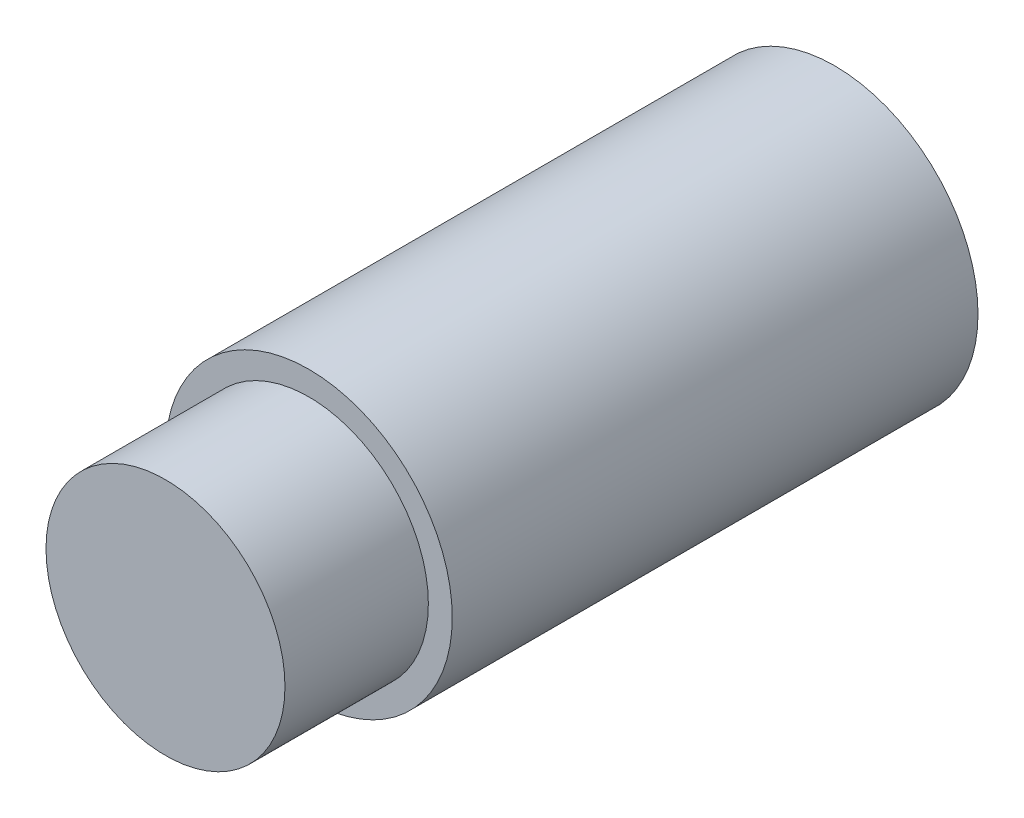
ISO-10303-21;
HEADER;
FILE_DESCRIPTION(('STEP AP214'),'2;1');
FILE_NAME('part.step','',(''),(''),'','','');
FILE_SCHEMA(('AUTOMOTIVE_DESIGN { 1 0 10303 214 1 1 1 1 }'));
ENDSEC;
DATA;
#1=APPLICATION_CONTEXT('core data for automotive mechanical design processes');
#2=APPLICATION_PROTOCOL_DEFINITION('international standard','automotive_design',2000,#1);
#3=PRODUCT_CONTEXT('',#1,'mechanical');
#4=PRODUCT('Part','Part','',(#3));
#5=PRODUCT_RELATED_PRODUCT_CATEGORY('part','',(#4));
#6=PRODUCT_DEFINITION_FORMATION('','',#4);
#7=PRODUCT_DEFINITION_CONTEXT('part definition',#1,'design');
#8=PRODUCT_DEFINITION('design','',#6,#7);
#9=PRODUCT_DEFINITION_SHAPE('','',#8);
#10=(LENGTH_UNIT() NAMED_UNIT(*) SI_UNIT(.MILLI.,.METRE.));
#11=(NAMED_UNIT(*) PLANE_ANGLE_UNIT() SI_UNIT($,.RADIAN.));
#12=(NAMED_UNIT(*) SI_UNIT($,.STERADIAN.) SOLID_ANGLE_UNIT());
#13=UNCERTAINTY_MEASURE_WITH_UNIT(LENGTH_MEASURE(1.E-05),#10,'distance_accuracy_value','');
#14=(GEOMETRIC_REPRESENTATION_CONTEXT(3) GLOBAL_UNCERTAINTY_ASSIGNED_CONTEXT((#13)) GLOBAL_UNIT_ASSIGNED_CONTEXT((#10,
#11,#12)) REPRESENTATION_CONTEXT('',''));
#15=CARTESIAN_POINT('',(0.,0.,0.));
#16=DIRECTION('',(0.,0.,1.));
#17=DIRECTION('',(1.,0.,0.));
#18=AXIS2_PLACEMENT_3D('',#15,#16,#17);
#19=CARTESIAN_POINT('',(0.,0.,11.));
#20=DIRECTION('',(0.,0.,1.));
#21=DIRECTION('',(1.,0.,0.));
#22=AXIS2_PLACEMENT_3D('',#19,#20,#21);
#23=PLANE('',#22);
#24=CARTESIAN_POINT('',(0.,0.,11.));
#25=DIRECTION('',(0.,0.,1.));
#26=DIRECTION('',(1.,0.,0.));
#27=AXIS2_PLACEMENT_3D('',#24,#25,#26);
#28=CIRCLE('',#27,3.);
#29=CARTESIAN_POINT('',(3.,0.,11.));
#30=VERTEX_POINT('',#29);
#31=EDGE_CURVE('E10',#30,#30,#28,.T.);
#32=ORIENTED_EDGE('',*,*,#31,.T.);
#33=EDGE_LOOP('',(#32));
#34=FACE_BOUND('',#33,.T.);
#35=CARTESIAN_POINT('',(0.,0.,11.));
#36=DIRECTION('',(0.,0.,1.));
#37=DIRECTION('',(1.,0.,0.));
#38=AXIS2_PLACEMENT_3D('',#35,#36,#37);
#39=CIRCLE('',#38,2.5);
#40=CARTESIAN_POINT('',(2.5,0.,11.));
#41=VERTEX_POINT('',#40);
#42=EDGE_CURVE('E46',#41,#41,#39,.T.);
#43=ORIENTED_EDGE('',*,*,#42,.F.);
#44=EDGE_LOOP('',(#43));
#45=FACE_BOUND('',#44,.T.);
#46=ADVANCED_FACE('F33',(#34,#45),#23,.T.);
#47=CARTESIAN_POINT('',(0.,0.,11.));
#48=DIRECTION('',(0.,0.,-1.));
#49=DIRECTION('',(-1.,0.,0.));
#50=AXIS2_PLACEMENT_3D('',#47,#48,#49);
#51=CYLINDRICAL_SURFACE('',#50,3.);
#52=ORIENTED_EDGE('',*,*,#31,.F.);
#53=EDGE_LOOP('',(#52));
#54=FACE_BOUND('',#53,.T.);
#55=CARTESIAN_POINT('',(0.,0.,0.));
#56=DIRECTION('',(0.,0.,1.));
#57=DIRECTION('',(1.,0.,0.));
#58=AXIS2_PLACEMENT_3D('',#55,#56,#57);
#59=CIRCLE('',#58,3.);
#60=CARTESIAN_POINT('',(3.,0.,0.));
#61=VERTEX_POINT('',#60);
#62=EDGE_CURVE('E37',#61,#61,#59,.T.);
#63=ORIENTED_EDGE('',*,*,#62,.T.);
#64=EDGE_LOOP('',(#63));
#65=FACE_BOUND('',#64,.T.);
#66=ADVANCED_FACE('F35',(#54,#65),#51,.T.);
#67=CARTESIAN_POINT('',(0.,0.,0.));
#68=DIRECTION('',(0.,0.,1.));
#69=DIRECTION('',(1.,0.,0.));
#70=AXIS2_PLACEMENT_3D('',#67,#68,#69);
#71=PLANE('',#70);
#72=ORIENTED_EDGE('',*,*,#62,.F.);
#73=EDGE_LOOP('',(#72));
#74=FACE_BOUND('',#73,.T.);
#75=ADVANCED_FACE('F57',(#74),#71,.F.);
#76=CARTESIAN_POINT('',(0.,0.,14.));
#77=DIRECTION('',(0.,0.,-1.));
#78=DIRECTION('',(-1.,0.,0.));
#79=AXIS2_PLACEMENT_3D('',#76,#77,#78);
#80=CYLINDRICAL_SURFACE('',#79,2.5);
#81=CARTESIAN_POINT('',(0.,0.,14.));
#82=DIRECTION('',(0.,0.,1.));
#83=DIRECTION('',(1.,0.,0.));
#84=AXIS2_PLACEMENT_3D('',#81,#82,#83);
#85=CIRCLE('',#84,2.5);
#86=CARTESIAN_POINT('',(2.5,0.,14.));
#87=VERTEX_POINT('',#86);
#88=EDGE_CURVE('E44',#87,#87,#85,.T.);
#89=ORIENTED_EDGE('',*,*,#88,.F.);
#90=EDGE_LOOP('',(#89));
#91=FACE_BOUND('',#90,.T.);
#92=ORIENTED_EDGE('',*,*,#42,.T.);
#93=EDGE_LOOP('',(#92));
#94=FACE_BOUND('',#93,.T.);
#95=ADVANCED_FACE('F54',(#91,#94),#80,.T.);
#96=CARTESIAN_POINT('',(0.,0.,14.));
#97=DIRECTION('',(0.,0.,1.));
#98=DIRECTION('',(1.,0.,0.));
#99=AXIS2_PLACEMENT_3D('',#96,#97,#98);
#100=PLANE('',#99);
#101=ORIENTED_EDGE('',*,*,#88,.T.);
#102=EDGE_LOOP('',(#101));
#103=FACE_BOUND('',#102,.T.);
#104=ADVANCED_FACE('F52',(#103),#100,.T.);
#105=CLOSED_SHELL('',(#46,#66,#75,#95,#104));
#106=MANIFOLD_SOLID_BREP('B2',#105);
#107=ADVANCED_BREP_SHAPE_REPRESENTATION('',(#18,#106),#14);
#108=SHAPE_DEFINITION_REPRESENTATION(#9,#107);
ENDSEC;
END-ISO-10303-21;
